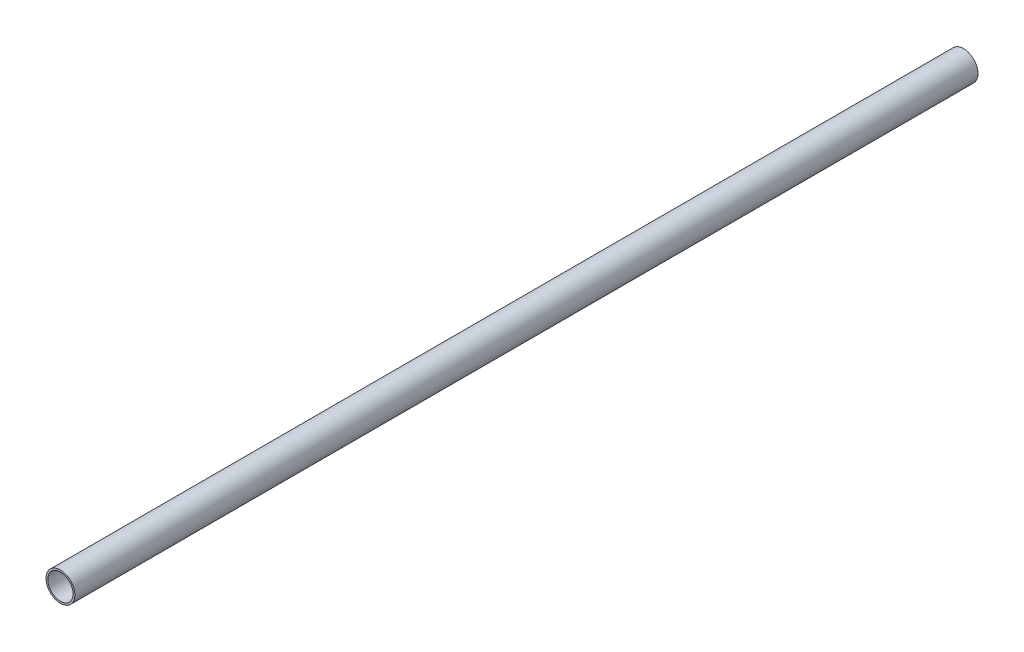
ISO-10303-21;
HEADER;
FILE_DESCRIPTION(('STEP AP214'),'2;1');
FILE_NAME('part.step','',(''),(''),'','','');
FILE_SCHEMA(('AUTOMOTIVE_DESIGN { 1 0 10303 214 1 1 1 1 }'));
ENDSEC;
DATA;
#1=APPLICATION_CONTEXT('core data for automotive mechanical design processes');
#2=APPLICATION_PROTOCOL_DEFINITION('international standard','automotive_design',2000,#1);
#3=PRODUCT_CONTEXT('',#1,'mechanical');
#4=PRODUCT('Part','Part','',(#3));
#5=PRODUCT_RELATED_PRODUCT_CATEGORY('part','',(#4));
#6=PRODUCT_DEFINITION_FORMATION('','',#4);
#7=PRODUCT_DEFINITION_CONTEXT('part definition',#1,'design');
#8=PRODUCT_DEFINITION('design','',#6,#7);
#9=PRODUCT_DEFINITION_SHAPE('','',#8);
#10=(LENGTH_UNIT() NAMED_UNIT(*) SI_UNIT(.MILLI.,.METRE.));
#11=(NAMED_UNIT(*) PLANE_ANGLE_UNIT() SI_UNIT($,.RADIAN.));
#12=(NAMED_UNIT(*) SI_UNIT($,.STERADIAN.) SOLID_ANGLE_UNIT());
#13=UNCERTAINTY_MEASURE_WITH_UNIT(LENGTH_MEASURE(1.E-05),#10,'distance_accuracy_value','');
#14=(GEOMETRIC_REPRESENTATION_CONTEXT(3) GLOBAL_UNCERTAINTY_ASSIGNED_CONTEXT((#13)) GLOBAL_UNIT_ASSIGNED_CONTEXT((#10,
#11,#12)) REPRESENTATION_CONTEXT('',''));
#15=CARTESIAN_POINT('',(0.,0.,0.));
#16=DIRECTION('',(0.,0.,1.));
#17=DIRECTION('',(1.,0.,0.));
#18=AXIS2_PLACEMENT_3D('',#15,#16,#17);
#19=CARTESIAN_POINT('',(0.,0.,500.));
#20=DIRECTION('',(0.,0.,1.));
#21=DIRECTION('',(1.,0.,0.));
#22=AXIS2_PLACEMENT_3D('',#19,#20,#21);
#23=PLANE('',#22);
#24=CARTESIAN_POINT('',(0.,0.,500.));
#25=DIRECTION('',(0.,0.,1.));
#26=DIRECTION('',(1.,0.,0.));
#27=AXIS2_PLACEMENT_3D('',#24,#25,#26);
#28=CIRCLE('',#27,8.);
#29=CARTESIAN_POINT('',(8.,0.,500.));
#30=VERTEX_POINT('',#29);
#31=EDGE_CURVE('E10',#30,#30,#28,.T.);
#32=ORIENTED_EDGE('',*,*,#31,.T.);
#33=EDGE_LOOP('',(#32));
#34=FACE_BOUND('',#33,.T.);
#35=CARTESIAN_POINT('',(0.,0.,500.));
#36=DIRECTION('',(0.,0.,1.));
#37=DIRECTION('',(1.,0.,0.));
#38=AXIS2_PLACEMENT_3D('',#35,#36,#37);
#39=CIRCLE('',#38,7.);
#40=CARTESIAN_POINT('',(7.,0.,500.));
#41=VERTEX_POINT('',#40);
#42=EDGE_CURVE('E50',#41,#41,#39,.T.);
#43=ORIENTED_EDGE('',*,*,#42,.F.);
#44=EDGE_LOOP('',(#43));
#45=FACE_BOUND('',#44,.T.);
#46=ADVANCED_FACE('F38',(#34,#45),#23,.T.);
#47=CARTESIAN_POINT('',(0.,0.,0.));
#48=DIRECTION('',(0.,0.,1.));
#49=DIRECTION('',(1.,0.,0.));
#50=AXIS2_PLACEMENT_3D('',#47,#48,#49);
#51=PLANE('',#50);
#52=CARTESIAN_POINT('',(0.,0.,0.));
#53=DIRECTION('',(0.,0.,1.));
#54=DIRECTION('',(1.,0.,0.));
#55=AXIS2_PLACEMENT_3D('',#52,#53,#54);
#56=CIRCLE('',#55,8.);
#57=CARTESIAN_POINT('',(8.,0.,0.));
#58=VERTEX_POINT('',#57);
#59=EDGE_CURVE('E37',#58,#58,#56,.T.);
#60=ORIENTED_EDGE('',*,*,#59,.F.);
#61=EDGE_LOOP('',(#60));
#62=FACE_BOUND('',#61,.T.);
#63=CARTESIAN_POINT('',(0.,0.,0.));
#64=DIRECTION('',(0.,0.,1.));
#65=DIRECTION('',(1.,0.,0.));
#66=AXIS2_PLACEMENT_3D('',#63,#64,#65);
#67=CIRCLE('',#66,7.);
#68=CARTESIAN_POINT('',(7.,0.,0.));
#69=VERTEX_POINT('',#68);
#70=EDGE_CURVE('E47',#69,#69,#67,.T.);
#71=ORIENTED_EDGE('',*,*,#70,.T.);
#72=EDGE_LOOP('',(#71));
#73=FACE_BOUND('',#72,.T.);
#74=ADVANCED_FACE('F56',(#62,#73),#51,.F.);
#75=CARTESIAN_POINT('',(0.,0.,500.));
#76=DIRECTION('',(0.,0.,-1.));
#77=DIRECTION('',(-1.,0.,0.));
#78=AXIS2_PLACEMENT_3D('',#75,#76,#77);
#79=CYLINDRICAL_SURFACE('',#78,8.);
#80=ORIENTED_EDGE('',*,*,#31,.F.);
#81=EDGE_LOOP('',(#80));
#82=FACE_BOUND('',#81,.T.);
#83=ORIENTED_EDGE('',*,*,#59,.T.);
#84=EDGE_LOOP('',(#83));
#85=FACE_BOUND('',#84,.T.);
#86=ADVANCED_FACE('F36',(#82,#85),#79,.T.);
#87=CARTESIAN_POINT('',(0.,0.,500.));
#88=DIRECTION('',(0.,0.,-1.));
#89=DIRECTION('',(-1.,0.,0.));
#90=AXIS2_PLACEMENT_3D('',#87,#88,#89);
#91=CYLINDRICAL_SURFACE('',#90,7.);
#92=ORIENTED_EDGE('',*,*,#42,.T.);
#93=EDGE_LOOP('',(#92));
#94=FACE_BOUND('',#93,.T.);
#95=ORIENTED_EDGE('',*,*,#70,.F.);
#96=EDGE_LOOP('',(#95));
#97=FACE_BOUND('',#96,.T.);
#98=ADVANCED_FACE('F54',(#94,#97),#91,.F.);
#99=CLOSED_SHELL('',(#46,#74,#86,#98));
#100=MANIFOLD_SOLID_BREP('B2',#99);
#101=ADVANCED_BREP_SHAPE_REPRESENTATION('',(#18,#100),#14);
#102=SHAPE_DEFINITION_REPRESENTATION(#9,#101);
ENDSEC;
END-ISO-10303-21;
